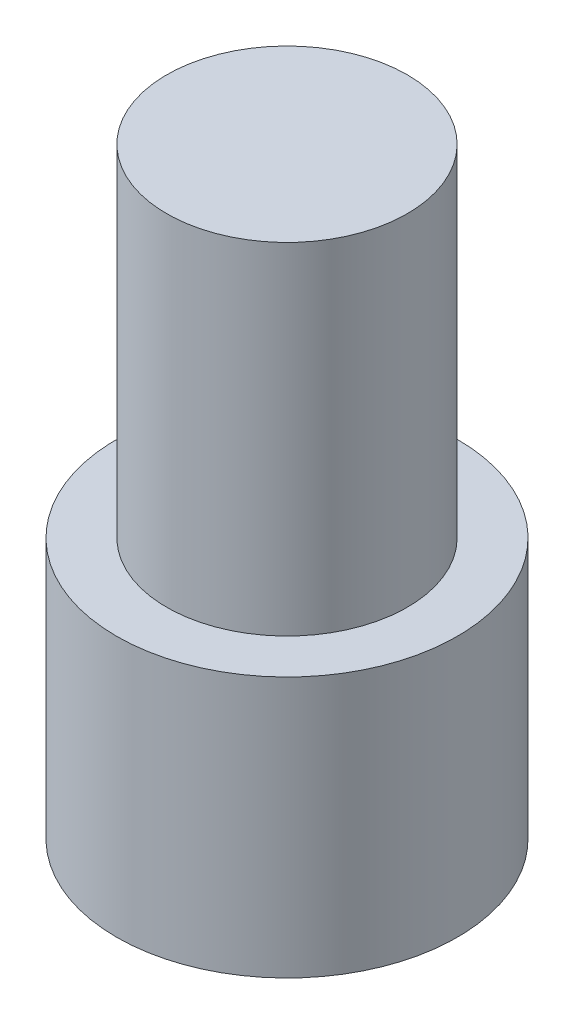
ISO-10303-21;
HEADER;
FILE_DESCRIPTION(('STEP AP214'),'2;1');
FILE_NAME('part.step','',(''),(''),'','','');
FILE_SCHEMA(('AUTOMOTIVE_DESIGN { 1 0 10303 214 1 1 1 1 }'));
ENDSEC;
DATA;
#1=APPLICATION_CONTEXT('core data for automotive mechanical design processes');
#2=APPLICATION_PROTOCOL_DEFINITION('international standard','automotive_design',2000,#1);
#3=PRODUCT_CONTEXT('',#1,'mechanical');
#4=PRODUCT('Part','Part','',(#3));
#5=PRODUCT_RELATED_PRODUCT_CATEGORY('part','',(#4));
#6=PRODUCT_DEFINITION_FORMATION('','',#4);
#7=PRODUCT_DEFINITION_CONTEXT('part definition',#1,'design');
#8=PRODUCT_DEFINITION('design','',#6,#7);
#9=PRODUCT_DEFINITION_SHAPE('','',#8);
#10=(LENGTH_UNIT() NAMED_UNIT(*) SI_UNIT(.MILLI.,.METRE.));
#11=(NAMED_UNIT(*) PLANE_ANGLE_UNIT() SI_UNIT($,.RADIAN.));
#12=(NAMED_UNIT(*) SI_UNIT($,.STERADIAN.) SOLID_ANGLE_UNIT());
#13=UNCERTAINTY_MEASURE_WITH_UNIT(LENGTH_MEASURE(1.E-05),#10,'distance_accuracy_value','');
#14=(GEOMETRIC_REPRESENTATION_CONTEXT(3) GLOBAL_UNCERTAINTY_ASSIGNED_CONTEXT((#13)) GLOBAL_UNIT_ASSIGNED_CONTEXT((#10,
#11,#12)) REPRESENTATION_CONTEXT('',''));
#15=CARTESIAN_POINT('',(0.,0.,0.));
#16=DIRECTION('',(0.,0.,1.));
#17=DIRECTION('',(1.,0.,0.));
#18=AXIS2_PLACEMENT_3D('',#15,#16,#17);
#19=CARTESIAN_POINT('',(0.,0.,0.));
#20=DIRECTION('',(0.,1.,0.));
#21=DIRECTION('',(0.,0.,1.));
#22=AXIS2_PLACEMENT_3D('',#19,#20,#21);
#23=PLANE('',#22);
#24=CARTESIAN_POINT('',(0.,0.,0.));
#25=DIRECTION('',(0.,-1.,0.));
#26=DIRECTION('',(0.,0.,-1.));
#27=AXIS2_PLACEMENT_3D('',#24,#25,#26);
#28=CIRCLE('',#27,0.6);
#29=CARTESIAN_POINT('',(0.,0.,-0.6));
#30=VERTEX_POINT('',#29);
#31=EDGE_CURVE('E10',#30,#30,#28,.T.);
#32=ORIENTED_EDGE('',*,*,#31,.F.);
#33=EDGE_LOOP('',(#32));
#34=FACE_BOUND('',#33,.T.);
#35=ADVANCED_FACE('F31',(#34),#23,.T.);
#36=CARTESIAN_POINT('',(0.,0.,0.));
#37=DIRECTION('',(0.,-1.,0.));
#38=DIRECTION('',(0.,0.,-1.));
#39=AXIS2_PLACEMENT_3D('',#36,#37,#38);
#40=CYLINDRICAL_SURFACE('',#39,0.6);
#41=ORIENTED_EDGE('',*,*,#31,.T.);
#42=EDGE_LOOP('',(#41));
#43=FACE_BOUND('',#42,.T.);
#44=CARTESIAN_POINT('',(0.,-1.7,0.));
#45=DIRECTION('',(0.,-1.,0.));
#46=DIRECTION('',(0.,0.,-1.));
#47=AXIS2_PLACEMENT_3D('',#44,#45,#46);
#48=CIRCLE('',#47,0.6);
#49=CARTESIAN_POINT('',(0.,-1.7,-0.6));
#50=VERTEX_POINT('',#49);
#51=EDGE_CURVE('E37',#50,#50,#48,.T.);
#52=ORIENTED_EDGE('',*,*,#51,.F.);
#53=EDGE_LOOP('',(#52));
#54=FACE_BOUND('',#53,.T.);
#55=ADVANCED_FACE('F63',(#43,#54),#40,.T.);
#56=CARTESIAN_POINT('',(0.6,-1.7,0.));
#57=DIRECTION('',(0.,1.,0.));
#58=DIRECTION('',(0.,0.,1.));
#59=AXIS2_PLACEMENT_3D('',#56,#57,#58);
#60=PLANE('',#59);
#61=ORIENTED_EDGE('',*,*,#51,.T.);
#62=EDGE_LOOP('',(#61));
#63=FACE_BOUND('',#62,.T.);
#64=CARTESIAN_POINT('',(0.,-1.7,0.));
#65=DIRECTION('',(0.,-1.,0.));
#66=DIRECTION('',(0.,0.,-1.));
#67=AXIS2_PLACEMENT_3D('',#64,#65,#66);
#68=CIRCLE('',#67,0.849999999999998);
#69=CARTESIAN_POINT('',(0.,-1.7,-0.849999999999998));
#70=VERTEX_POINT('',#69);
#71=EDGE_CURVE('E41',#70,#70,#68,.T.);
#72=ORIENTED_EDGE('',*,*,#71,.F.);
#73=EDGE_LOOP('',(#72));
#74=FACE_BOUND('',#73,.T.);
#75=ADVANCED_FACE('F55',(#63,#74),#60,.T.);
#76=CARTESIAN_POINT('',(0.,0.,0.));
#77=DIRECTION('',(0.,-1.,0.));
#78=DIRECTION('',(0.,0.,-1.));
#79=AXIS2_PLACEMENT_3D('',#76,#77,#78);
#80=CYLINDRICAL_SURFACE('',#79,0.849999999999998);
#81=ORIENTED_EDGE('',*,*,#71,.T.);
#82=EDGE_LOOP('',(#81));
#83=FACE_BOUND('',#82,.T.);
#84=CARTESIAN_POINT('',(0.,-3.,0.));
#85=DIRECTION('',(0.,-1.,0.));
#86=DIRECTION('',(0.,0.,-1.));
#87=AXIS2_PLACEMENT_3D('',#84,#85,#86);
#88=CIRCLE('',#87,0.849999999999998);
#89=CARTESIAN_POINT('',(0.,-3.,-0.849999999999998));
#90=VERTEX_POINT('',#89);
#91=EDGE_CURVE('E45',#90,#90,#88,.T.);
#92=ORIENTED_EDGE('',*,*,#91,.F.);
#93=EDGE_LOOP('',(#92));
#94=FACE_BOUND('',#93,.T.);
#95=ADVANCED_FACE('F53',(#83,#94),#80,.T.);
#96=CARTESIAN_POINT('',(0.849999999999998,-3.,0.));
#97=DIRECTION('',(0.,-1.,0.));
#98=DIRECTION('',(0.,0.,-1.));
#99=AXIS2_PLACEMENT_3D('',#96,#97,#98);
#100=PLANE('',#99);
#101=ORIENTED_EDGE('',*,*,#91,.T.);
#102=EDGE_LOOP('',(#101));
#103=FACE_BOUND('',#102,.T.);
#104=ADVANCED_FACE('F51',(#103),#100,.T.);
#105=CLOSED_SHELL('',(#35,#55,#75,#95,#104));
#106=MANIFOLD_SOLID_BREP('B2',#105);
#107=ADVANCED_BREP_SHAPE_REPRESENTATION('',(#18,#106),#14);
#108=SHAPE_DEFINITION_REPRESENTATION(#9,#107);
ENDSEC;
END-ISO-10303-21;
